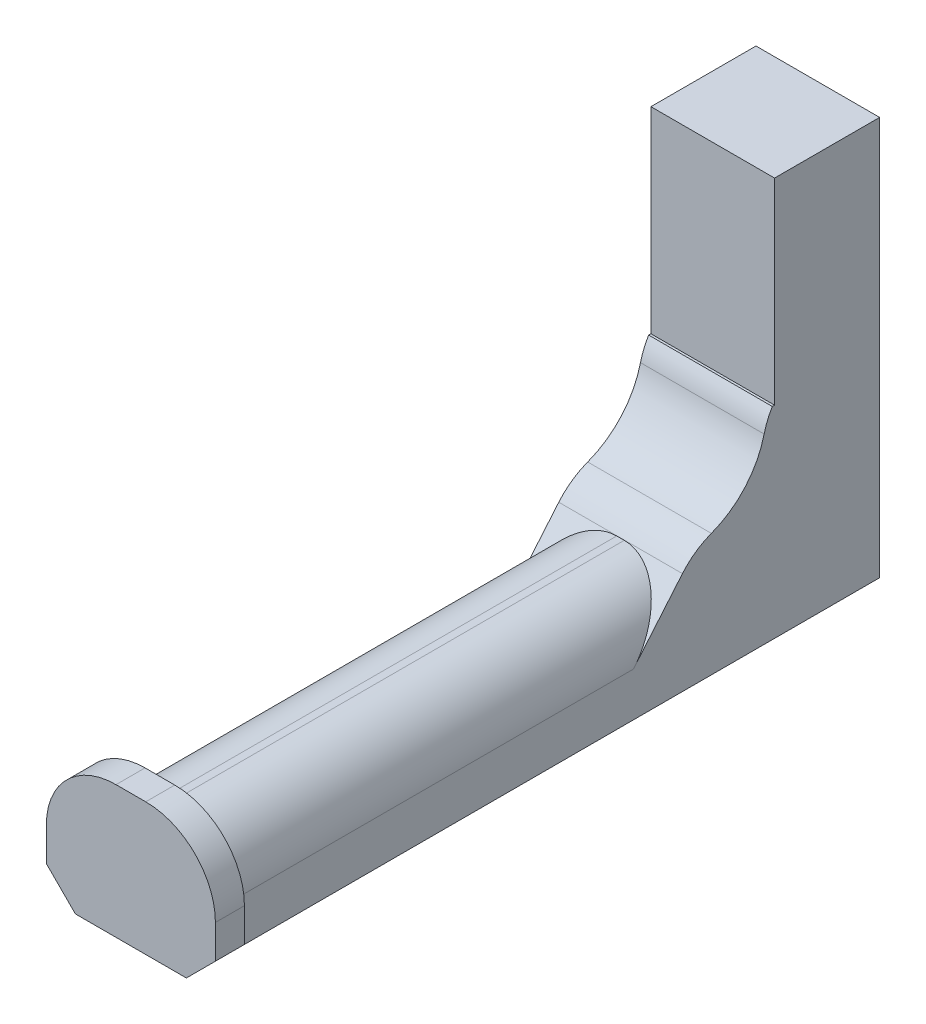
ISO-10303-21;
HEADER;
FILE_DESCRIPTION(('STEP AP214'),'2;1');
FILE_NAME('part.step','',(''),(''),'','','');
FILE_SCHEMA(('AUTOMOTIVE_DESIGN { 1 0 10303 214 1 1 1 1 }'));
ENDSEC;
DATA;
#1=APPLICATION_CONTEXT('core data for automotive mechanical design processes');
#2=APPLICATION_PROTOCOL_DEFINITION('international standard','automotive_design',2000,#1);
#3=PRODUCT_CONTEXT('',#1,'mechanical');
#4=PRODUCT('Part','Part','',(#3));
#5=PRODUCT_RELATED_PRODUCT_CATEGORY('part','',(#4));
#6=PRODUCT_DEFINITION_FORMATION('','',#4);
#7=PRODUCT_DEFINITION_CONTEXT('part definition',#1,'design');
#8=PRODUCT_DEFINITION('design','',#6,#7);
#9=PRODUCT_DEFINITION_SHAPE('','',#8);
#10=(LENGTH_UNIT() NAMED_UNIT(*) SI_UNIT(.MILLI.,.METRE.));
#11=(NAMED_UNIT(*) PLANE_ANGLE_UNIT() SI_UNIT($,.RADIAN.));
#12=(NAMED_UNIT(*) SI_UNIT($,.STERADIAN.) SOLID_ANGLE_UNIT());
#13=UNCERTAINTY_MEASURE_WITH_UNIT(LENGTH_MEASURE(1.E-05),#10,'distance_accuracy_value','');
#14=(GEOMETRIC_REPRESENTATION_CONTEXT(3) GLOBAL_UNCERTAINTY_ASSIGNED_CONTEXT((#13)) GLOBAL_UNIT_ASSIGNED_CONTEXT((#10,
#11,#12)) REPRESENTATION_CONTEXT('',''));
#15=CARTESIAN_POINT('',(0.,0.,0.));
#16=DIRECTION('',(0.,0.,1.));
#17=DIRECTION('',(1.,0.,0.));
#18=AXIS2_PLACEMENT_3D('',#15,#16,#17);
#19=CARTESIAN_POINT('',(0.,0.,0.));
#20=DIRECTION('',(0.,0.,-1.));
#21=DIRECTION('',(-1.,0.,0.));
#22=AXIS2_PLACEMENT_3D('',#19,#20,#21);
#23=PLANE('',#22);
#24=DIRECTION('',(-1.,0.,0.));
#25=VECTOR('',#24,1.);
#26=CARTESIAN_POINT('',(-10.65,1.12293527824647,0.));
#27=LINE('',#26,#25);
#28=CARTESIAN_POINT('',(10.65,1.12293527824647,0.));
#29=VERTEX_POINT('',#28);
#30=CARTESIAN_POINT('',(-10.65,1.12293527824647,0.));
#31=VERTEX_POINT('',#30);
#32=EDGE_CURVE('E417',#29,#31,#27,.T.);
#33=ORIENTED_EDGE('',*,*,#32,.F.);
#34=DIRECTION('',(0.,1.,0.));
#35=VECTOR('',#34,1.);
#36=CARTESIAN_POINT('',(10.65,-35.,0.));
#37=LINE('',#36,#35);
#38=CARTESIAN_POINT('',(10.65,35.,0.));
#39=VERTEX_POINT('',#38);
#40=EDGE_CURVE('E246',#29,#39,#37,.T.);
#41=ORIENTED_EDGE('',*,*,#40,.T.);
#42=DIRECTION('',(-1.,0.,0.));
#43=VECTOR('',#42,1.);
#44=CARTESIAN_POINT('',(-10.65,35.,0.));
#45=LINE('',#44,#43);
#46=CARTESIAN_POINT('',(-10.65,35.,0.));
#47=VERTEX_POINT('',#46);
#48=EDGE_CURVE('E255',#39,#47,#45,.T.);
#49=ORIENTED_EDGE('',*,*,#48,.T.);
#50=DIRECTION('',(0.,-1.,0.));
#51=VECTOR('',#50,1.);
#52=CARTESIAN_POINT('',(-10.65,-35.,0.));
#53=LINE('',#52,#51);
#54=EDGE_CURVE('E251',#47,#31,#53,.T.);
#55=ORIENTED_EDGE('',*,*,#54,.T.);
#56=EDGE_LOOP('',(#33,#41,#49,#55));
#57=FACE_BOUND('',#56,.T.);
#58=ADVANCED_FACE('F33',(#57),#23,.F.);
#59=CARTESIAN_POINT('',(-10.65,-16.0990655931812,95.));
#60=DIRECTION('',(0.,-1.,0.));
#61=DIRECTION('',(0.,0.,-1.));
#62=AXIS2_PLACEMENT_3D('',#59,#60,#61);
#63=PLANE('',#62);
#64=DIRECTION('',(1.,0.,0.));
#65=VECTOR('',#64,1.);
#66=CARTESIAN_POINT('',(-10.65,-16.0990655931812,15.891773496986));
#67=LINE('',#66,#65);
#68=CARTESIAN_POINT('',(0.649999999999998,-16.0990655931812,15.891773496986));
#69=VERTEX_POINT('',#68);
#70=CARTESIAN_POINT('',(-0.650000000000001,-16.0990655931812,15.891773496986));
#71=VERTEX_POINT('',#70);
#72=EDGE_CURVE('E281',#69,#71,#67,.F.);
#73=ORIENTED_EDGE('',*,*,#72,.T.);
#74=DIRECTION('',(0.,0.,-1.));
#75=VECTOR('',#74,1.);
#76=CARTESIAN_POINT('',(-0.650000000000001,-16.0990655931812,95.));
#77=LINE('',#76,#75);
#78=CARTESIAN_POINT('',(-0.650000000000001,-16.0990655931812,95.));
#79=VERTEX_POINT('',#78);
#80=EDGE_CURVE('E447',#71,#79,#77,.F.);
#81=ORIENTED_EDGE('',*,*,#80,.T.);
#82=DIRECTION('',(-1.,0.,0.));
#83=VECTOR('',#82,1.);
#84=CARTESIAN_POINT('',(-10.65,-16.0990655931812,95.));
#85=LINE('',#84,#83);
#86=CARTESIAN_POINT('',(0.649999999999998,-16.0990655931812,95.));
#87=VERTEX_POINT('',#86);
#88=EDGE_CURVE('E219',#87,#79,#85,.T.);
#89=ORIENTED_EDGE('',*,*,#88,.F.);
#90=DIRECTION('',(0.,0.,-1.));
#91=VECTOR('',#90,1.);
#92=CARTESIAN_POINT('',(0.649999999999998,-16.0990655931812,15.891773496986));
#93=LINE('',#92,#91);
#94=EDGE_CURVE('E450',#87,#69,#93,.T.);
#95=ORIENTED_EDGE('',*,*,#94,.T.);
#96=EDGE_LOOP('',(#73,#81,#89,#95));
#97=FACE_BOUND('',#96,.T.);
#98=ADVANCED_FACE('F466',(#97),#63,.F.);
#99=CARTESIAN_POINT('',(0.,0.,-3.));
#100=DIRECTION('',(0.,0.,-1.));
#101=DIRECTION('',(-1.,0.,0.));
#102=AXIS2_PLACEMENT_3D('',#99,#100,#101);
#103=PLANE('',#102);
#104=DIRECTION('',(0.,-1.,0.));
#105=VECTOR('',#104,1.);
#106=CARTESIAN_POINT('',(-7.69999999999999,35.,-3.));
#107=LINE('',#106,#105);
#108=CARTESIAN_POINT('',(-7.69999999999999,32.,-3.));
#109=VERTEX_POINT('',#108);
#110=CARTESIAN_POINT('',(-7.7,-35.,-3.));
#111=VERTEX_POINT('',#110);
#112=EDGE_CURVE('E208',#109,#111,#107,.T.);
#113=ORIENTED_EDGE('',*,*,#112,.F.);
#114=DIRECTION('',(-1.,0.,0.));
#115=VECTOR('',#114,1.);
#116=CARTESIAN_POINT('',(7.70000000000001,32.,-3.));
#117=LINE('',#116,#115);
#118=CARTESIAN_POINT('',(7.70000000000001,32.,-3.));
#119=VERTEX_POINT('',#118);
#120=EDGE_CURVE('E218',#119,#109,#117,.T.);
#121=ORIENTED_EDGE('',*,*,#120,.F.);
#122=DIRECTION('',(0.,1.,0.));
#123=VECTOR('',#122,1.);
#124=CARTESIAN_POINT('',(7.70000000000001,35.,-3.));
#125=LINE('',#124,#123);
#126=CARTESIAN_POINT('',(7.7,-35.,-3.));
#127=VERTEX_POINT('',#126);
#128=EDGE_CURVE('E217',#127,#119,#125,.T.);
#129=ORIENTED_EDGE('',*,*,#128,.F.);
#130=DIRECTION('',(1.,0.,0.));
#131=VECTOR('',#130,1.);
#132=CARTESIAN_POINT('',(-10.65,-35.,-3.));
#133=LINE('',#132,#131);
#134=EDGE_CURVE('E249',#111,#127,#133,.T.);
#135=ORIENTED_EDGE('',*,*,#134,.F.);
#136=EDGE_LOOP('',(#113,#121,#129,#135));
#137=FACE_BOUND('',#136,.T.);
#138=ADVANCED_FACE('F468',(#137),#103,.T.);
#139=CARTESIAN_POINT('',(7.70000000000001,35.,-18.1));
#140=DIRECTION('',(1.,0.,0.));
#141=DIRECTION('',(0.,1.,0.));
#142=AXIS2_PLACEMENT_3D('',#139,#140,#141);
#143=PLANE('',#142);
#144=DIRECTION('',(0.,0.,1.));
#145=VECTOR('',#144,1.);
#146=CARTESIAN_POINT('',(7.70000000000001,32.,-33.7894869259642));
#147=LINE('',#146,#145);
#148=CARTESIAN_POINT('',(7.70000000000001,32.,-18.1));
#149=VERTEX_POINT('',#148);
#150=EDGE_CURVE('E201',#149,#119,#147,.T.);
#151=ORIENTED_EDGE('',*,*,#150,.F.);
#152=DIRECTION('',(0.,1.,0.));
#153=VECTOR('',#152,1.);
#154=CARTESIAN_POINT('',(7.70000000000001,35.,-18.1));
#155=LINE('',#154,#153);
#156=CARTESIAN_POINT('',(7.7,-35.,-18.1));
#157=VERTEX_POINT('',#156);
#158=EDGE_CURVE('E215',#157,#149,#155,.T.);
#159=ORIENTED_EDGE('',*,*,#158,.F.);
#160=DIRECTION('',(0.,0.,1.));
#161=VECTOR('',#160,1.);
#162=CARTESIAN_POINT('',(7.7,-35.,-18.1));
#163=LINE('',#162,#161);
#164=EDGE_CURVE('E229',#157,#127,#163,.T.);
#165=ORIENTED_EDGE('',*,*,#164,.T.);
#166=ORIENTED_EDGE('',*,*,#128,.T.);
#167=EDGE_LOOP('',(#151,#159,#165,#166));
#168=FACE_BOUND('',#167,.T.);
#169=ADVANCED_FACE('F213',(#168),#143,.F.);
#170=CARTESIAN_POINT('',(-7.69999999999999,35.,-18.1));
#171=DIRECTION('',(-1.,0.,0.));
#172=DIRECTION('',(0.,-1.,0.));
#173=AXIS2_PLACEMENT_3D('',#170,#171,#172);
#174=PLANE('',#173);
#175=DIRECTION('',(0.,0.,1.));
#176=VECTOR('',#175,1.);
#177=CARTESIAN_POINT('',(-7.69999999999999,32.,-33.7894869259642));
#178=LINE('',#177,#176);
#179=CARTESIAN_POINT('',(-7.69999999999999,32.,-18.1));
#180=VERTEX_POINT('',#179);
#181=EDGE_CURVE('E204',#180,#109,#178,.T.);
#182=ORIENTED_EDGE('',*,*,#181,.T.);
#183=ORIENTED_EDGE('',*,*,#112,.T.);
#184=DIRECTION('',(0.,0.,1.));
#185=VECTOR('',#184,1.);
#186=CARTESIAN_POINT('',(-7.7,-35.,-18.1));
#187=LINE('',#186,#185);
#188=CARTESIAN_POINT('',(-7.7,-35.,-18.1));
#189=VERTEX_POINT('',#188);
#190=EDGE_CURVE('E242',#189,#111,#187,.T.);
#191=ORIENTED_EDGE('',*,*,#190,.F.);
#192=DIRECTION('',(0.,-1.,0.));
#193=VECTOR('',#192,1.);
#194=CARTESIAN_POINT('',(-7.69999999999999,35.,-18.1));
#195=LINE('',#194,#193);
#196=EDGE_CURVE('E369',#180,#189,#195,.T.);
#197=ORIENTED_EDGE('',*,*,#196,.F.);
#198=EDGE_LOOP('',(#182,#183,#191,#197));
#199=FACE_BOUND('',#198,.T.);
#200=ADVANCED_FACE('F485',(#199),#174,.F.);
#201=CARTESIAN_POINT('',(10.65,-35.,-3.));
#202=DIRECTION('',(1.,0.,0.));
#203=DIRECTION('',(0.,0.,-1.));
#204=AXIS2_PLACEMENT_3D('',#201,#202,#203);
#205=PLANE('',#204);
#206=DIRECTION('',(0.,0.764976195533657,-0.644058553445921));
#207=VECTOR('',#206,1.);
#208=CARTESIAN_POINT('',(10.65,-17.8518988354685,17.3675413039462));
#209=LINE('',#208,#207);
#210=CARTESIAN_POINT('',(10.65,-16.075158958114,15.8716457166851));
#211=VERTEX_POINT('',#210);
#212=CARTESIAN_POINT('',(10.65,-26.0990655931812,24.3111015389078));
#213=VERTEX_POINT('',#212);
#214=EDGE_CURVE('E48',#211,#213,#209,.F.);
#215=ORIENTED_EDGE('',*,*,#214,.T.);
#216=DIRECTION('',(0.,0.,-1.));
#217=VECTOR('',#216,1.);
#218=CARTESIAN_POINT('',(10.65,-26.0990655931812,95.));
#219=LINE('',#218,#217);
#220=CARTESIAN_POINT('',(10.65,-26.0990655931812,95.));
#221=VERTEX_POINT('',#220);
#222=EDGE_CURVE('E53',#213,#221,#219,.F.);
#223=ORIENTED_EDGE('',*,*,#222,.T.);
#224=DIRECTION('',(0.,1.,0.));
#225=VECTOR('',#224,1.);
#226=CARTESIAN_POINT('',(10.65,-16.0990655931812,95.));
#227=LINE('',#226,#225);
#228=CARTESIAN_POINT('',(10.65,-33.6771159928631,95.));
#229=VERTEX_POINT('',#228);
#230=EDGE_CURVE('E306',#229,#221,#227,.T.);
#231=ORIENTED_EDGE('',*,*,#230,.F.);
#232=DIRECTION('',(0.,0.,-1.));
#233=VECTOR('',#232,1.);
#234=CARTESIAN_POINT('',(10.65,-33.6771159928631,-3.));
#235=LINE('',#234,#233);
#236=CARTESIAN_POINT('',(10.65,-33.6771159928631,-18.1));
#237=VERTEX_POINT('',#236);
#238=EDGE_CURVE('E310',#229,#237,#235,.T.);
#239=ORIENTED_EDGE('',*,*,#238,.T.);
#240=DIRECTION('',(0.,-1.,0.));
#241=VECTOR('',#240,1.);
#242=CARTESIAN_POINT('',(10.65,35.,-18.1));
#243=LINE('',#242,#241);
#244=CARTESIAN_POINT('',(10.65,35.,-18.1));
#245=VERTEX_POINT('',#244);
#246=EDGE_CURVE('E231',#245,#237,#243,.T.);
#247=ORIENTED_EDGE('',*,*,#246,.F.);
#248=DIRECTION('',(0.,0.,1.));
#249=VECTOR('',#248,1.);
#250=CARTESIAN_POINT('',(10.65,35.,-3.));
#251=LINE('',#250,#249);
#252=EDGE_CURVE('E243',#245,#39,#251,.T.);
#253=ORIENTED_EDGE('',*,*,#252,.T.);
#254=ORIENTED_EDGE('',*,*,#40,.F.);
#255=DIRECTION('',(0.,0.,-1.));
#256=VECTOR('',#255,1.);
#257=CARTESIAN_POINT('',(10.65,1.12293527824647,16.));
#258=LINE('',#257,#256);
#259=CARTESIAN_POINT('',(10.65,1.12293527824647,0.392006009504509));
#260=VERTEX_POINT('',#259);
#261=EDGE_CURVE('E403',#260,#29,#258,.T.);
#262=ORIENTED_EDGE('',*,*,#261,.F.);
#263=CARTESIAN_POINT('',(10.65,-5.09532535075491,-9.87119206662224));
#264=DIRECTION('',(1.,0.,0.));
#265=DIRECTION('',(0.,0.,-1.));
#266=AXIS2_PLACEMENT_3D('',#263,#264,#265);
#267=CIRCLE('',#266,12.);
#268=CARTESIAN_POINT('',(10.65,-2.29093778306864,1.79651595038808));
#269=VERTEX_POINT('',#268);
#270=EDGE_CURVE('E351',#260,#269,#267,.T.);
#271=ORIENTED_EDGE('',*,*,#270,.T.);
#272=CARTESIAN_POINT('',(10.65,1.12293527824647,16.));
#273=DIRECTION('',(1.,0.,0.));
#274=DIRECTION('',(0.,0.,-1.));
#275=AXIS2_PLACEMENT_3D('',#272,#273,#274);
#276=CIRCLE('',#275,14.6079939904955);
#277=CARTESIAN_POINT('',(10.65,-12.5620685263238,10.8897985073726));
#278=VERTEX_POINT('',#277);
#279=EDGE_CURVE('E420',#278,#269,#276,.T.);
#280=ORIENTED_EDGE('',*,*,#279,.F.);
#281=CARTESIAN_POINT('',(10.65,-23.8038615994651,6.69193137028119));
#282=DIRECTION('',(1.,0.,0.));
#283=DIRECTION('',(0.,0.,-1.));
#284=AXIS2_PLACEMENT_3D('',#281,#282,#283);
#285=CIRCLE('',#284,12.);
#286=EDGE_CURVE('E339',#278,#211,#285,.T.);
#287=ORIENTED_EDGE('',*,*,#286,.T.);
#288=EDGE_LOOP('',(#215,#223,#231,#239,#247,#253,#254,#262,#271,#280,#287));
#289=FACE_BOUND('',#288,.T.);
#290=ADVANCED_FACE('F272',(#289),#205,.T.);
#291=CARTESIAN_POINT('',(-10.65,-35.,-3.));
#292=DIRECTION('',(0.,-1.,0.));
#293=DIRECTION('',(0.,0.,-1.));
#294=AXIS2_PLACEMENT_3D('',#291,#292,#293);
#295=PLANE('',#294);
#296=DIRECTION('',(-1.,0.,0.));
#297=VECTOR('',#296,1.);
#298=CARTESIAN_POINT('',(10.65,-35.,-18.1));
#299=LINE('',#298,#297);
#300=CARTESIAN_POINT('',(9.32711599286305,-35.,-18.1));
#301=VERTEX_POINT('',#300);
#302=EDGE_CURVE('E224',#301,#157,#299,.T.);
#303=ORIENTED_EDGE('',*,*,#302,.F.);
#304=DIRECTION('',(0.,0.,1.));
#305=VECTOR('',#304,1.);
#306=CARTESIAN_POINT('',(9.32711599286305,-35.,100.));
#307=LINE('',#306,#305);
#308=CARTESIAN_POINT('',(9.32711599286305,-35.,100.));
#309=VERTEX_POINT('',#308);
#310=EDGE_CURVE('E314',#301,#309,#307,.T.);
#311=ORIENTED_EDGE('',*,*,#310,.T.);
#312=DIRECTION('',(1.,0.,0.));
#313=VECTOR('',#312,1.);
#314=CARTESIAN_POINT('',(-14.7908997357149,-35.,100.));
#315=LINE('',#314,#313);
#316=CARTESIAN_POINT('',(-9.79089973571489,-35.,100.));
#317=VERTEX_POINT('',#316);
#318=EDGE_CURVE('E356',#317,#309,#315,.T.);
#319=ORIENTED_EDGE('',*,*,#318,.F.);
#320=DIRECTION('',(0.,0.,-1.));
#321=VECTOR('',#320,1.);
#322=CARTESIAN_POINT('',(-9.79089973571489,-35.,95.));
#323=LINE('',#322,#321);
#324=CARTESIAN_POINT('',(-9.79089973571489,-35.,-18.1));
#325=VERTEX_POINT('',#324);
#326=EDGE_CURVE('E286',#317,#325,#323,.T.);
#327=ORIENTED_EDGE('',*,*,#326,.T.);
#328=DIRECTION('',(-1.,0.,0.));
#329=VECTOR('',#328,1.);
#330=CARTESIAN_POINT('',(-10.65,-35.,-18.1));
#331=LINE('',#330,#329);
#332=EDGE_CURVE('E371',#189,#325,#331,.T.);
#333=ORIENTED_EDGE('',*,*,#332,.F.);
#334=ORIENTED_EDGE('',*,*,#190,.T.);
#335=ORIENTED_EDGE('',*,*,#134,.T.);
#336=ORIENTED_EDGE('',*,*,#164,.F.);
#337=EDGE_LOOP('',(#303,#311,#319,#327,#333,#334,#335,#336));
#338=FACE_BOUND('',#337,.T.);
#339=ADVANCED_FACE('F386',(#338),#295,.T.);
#340=CARTESIAN_POINT('',(-10.65,-35.,-3.));
#341=DIRECTION('',(-1.,0.,0.));
#342=DIRECTION('',(0.,0.,1.));
#343=AXIS2_PLACEMENT_3D('',#340,#341,#342);
#344=PLANE('',#343);
#345=DIRECTION('',(0.,-1.,0.));
#346=VECTOR('',#345,1.);
#347=CARTESIAN_POINT('',(-10.65,-16.0990655931812,95.));
#348=LINE('',#347,#346);
#349=CARTESIAN_POINT('',(-10.65,-26.0990655931812,95.));
#350=VERTEX_POINT('',#349);
#351=CARTESIAN_POINT('',(-10.65,-34.1408997357149,95.));
#352=VERTEX_POINT('',#351);
#353=EDGE_CURVE('E308',#350,#352,#348,.T.);
#354=ORIENTED_EDGE('',*,*,#353,.F.);
#355=DIRECTION('',(0.,0.,-1.));
#356=VECTOR('',#355,1.);
#357=CARTESIAN_POINT('',(-10.65,-26.0990655931812,15.891773496986));
#358=LINE('',#357,#356);
#359=CARTESIAN_POINT('',(-10.65,-26.0990655931812,24.3111015389078));
#360=VERTEX_POINT('',#359);
#361=EDGE_CURVE('E353',#350,#360,#358,.T.);
#362=ORIENTED_EDGE('',*,*,#361,.T.);
#363=DIRECTION('',(0.,-0.764976195533657,0.644058553445921));
#364=VECTOR('',#363,1.);
#365=CARTESIAN_POINT('',(-10.65,-17.8518988354685,17.3675413039462));
#366=LINE('',#365,#364);
#367=CARTESIAN_POINT('',(-10.65,-16.075158958114,15.8716457166851));
#368=VERTEX_POINT('',#367);
#369=EDGE_CURVE('E261',#360,#368,#366,.F.);
#370=ORIENTED_EDGE('',*,*,#369,.T.);
#371=CARTESIAN_POINT('',(-10.65,-23.8038615994651,6.69193137028119));
#372=DIRECTION('',(-1.,0.,0.));
#373=DIRECTION('',(0.,0.,1.));
#374=AXIS2_PLACEMENT_3D('',#371,#372,#373);
#375=CIRCLE('',#374,12.);
#376=CARTESIAN_POINT('',(-10.65,-12.5620685263238,10.8897985073726));
#377=VERTEX_POINT('',#376);
#378=EDGE_CURVE('E343',#368,#377,#375,.T.);
#379=ORIENTED_EDGE('',*,*,#378,.T.);
#380=CARTESIAN_POINT('',(-10.65,1.12293527824647,16.));
#381=DIRECTION('',(-1.,0.,0.));
#382=DIRECTION('',(0.,0.,1.));
#383=AXIS2_PLACEMENT_3D('',#380,#381,#382);
#384=CIRCLE('',#383,14.6079939904955);
#385=CARTESIAN_POINT('',(-10.65,-2.29093778306864,1.79651595038808));
#386=VERTEX_POINT('',#385);
#387=EDGE_CURVE('E423',#386,#377,#384,.T.);
#388=ORIENTED_EDGE('',*,*,#387,.F.);
#389=CARTESIAN_POINT('',(-10.65,-5.09532535075491,-9.87119206662224));
#390=DIRECTION('',(-1.,0.,0.));
#391=DIRECTION('',(0.,0.,1.));
#392=AXIS2_PLACEMENT_3D('',#389,#390,#391);
#393=CIRCLE('',#392,12.);
#394=CARTESIAN_POINT('',(-10.65,1.12293527824647,0.392006009504509));
#395=VERTEX_POINT('',#394);
#396=EDGE_CURVE('E349',#386,#395,#393,.T.);
#397=ORIENTED_EDGE('',*,*,#396,.T.);
#398=DIRECTION('',(0.,0.,-1.));
#399=VECTOR('',#398,1.);
#400=CARTESIAN_POINT('',(-10.65,1.12293527824647,16.));
#401=LINE('',#400,#399);
#402=EDGE_CURVE('E415',#395,#31,#401,.T.);
#403=ORIENTED_EDGE('',*,*,#402,.T.);
#404=ORIENTED_EDGE('',*,*,#54,.F.);
#405=DIRECTION('',(0.,0.,1.));
#406=VECTOR('',#405,1.);
#407=CARTESIAN_POINT('',(-10.65,35.,-3.));
#408=LINE('',#407,#406);
#409=CARTESIAN_POINT('',(-10.65,35.,-18.1));
#410=VERTEX_POINT('',#409);
#411=EDGE_CURVE('E260',#410,#47,#408,.T.);
#412=ORIENTED_EDGE('',*,*,#411,.F.);
#413=DIRECTION('',(0.,1.,0.));
#414=VECTOR('',#413,1.);
#415=CARTESIAN_POINT('',(-10.65,35.,-18.1));
#416=LINE('',#415,#414);
#417=CARTESIAN_POINT('',(-10.65,-34.1408997357149,-18.1));
#418=VERTEX_POINT('',#417);
#419=EDGE_CURVE('E367',#418,#410,#416,.T.);
#420=ORIENTED_EDGE('',*,*,#419,.F.);
#421=DIRECTION('',(0.,0.,1.));
#422=VECTOR('',#421,1.);
#423=CARTESIAN_POINT('',(-10.65,-34.1408997357149,-3.));
#424=LINE('',#423,#422);
#425=EDGE_CURVE('E291',#418,#352,#424,.T.);
#426=ORIENTED_EDGE('',*,*,#425,.T.);
#427=EDGE_LOOP('',(#354,#362,#370,#379,#388,#397,#403,#404,#412,#420,#426));
#428=FACE_BOUND('',#427,.T.);
#429=ADVANCED_FACE('F433',(#428),#344,.T.);
#430=CARTESIAN_POINT('',(-10.65,35.,-3.));
#431=DIRECTION('',(0.,1.,0.));
#432=DIRECTION('',(0.,0.,1.));
#433=AXIS2_PLACEMENT_3D('',#430,#431,#432);
#434=PLANE('',#433);
#435=ORIENTED_EDGE('',*,*,#48,.F.);
#436=ORIENTED_EDGE('',*,*,#252,.F.);
#437=DIRECTION('',(1.,0.,0.));
#438=VECTOR('',#437,1.);
#439=CARTESIAN_POINT('',(10.65,35.,-18.1));
#440=LINE('',#439,#438);
#441=EDGE_CURVE('E226',#410,#245,#440,.T.);
#442=ORIENTED_EDGE('',*,*,#441,.F.);
#443=ORIENTED_EDGE('',*,*,#411,.T.);
#444=EDGE_LOOP('',(#435,#436,#442,#443));
#445=FACE_BOUND('',#444,.T.);
#446=ADVANCED_FACE('F275',(#445),#434,.T.);
#447=CARTESIAN_POINT('',(0.,0.,-18.1));
#448=DIRECTION('',(0.,0.,-1.));
#449=DIRECTION('',(-1.,0.,0.));
#450=AXIS2_PLACEMENT_3D('',#447,#448,#449);
#451=PLANE('',#450);
#452=ORIENTED_EDGE('',*,*,#246,.T.);
#453=DIRECTION('',(-0.70710678118655,-0.707106781186545,0.));
#454=VECTOR('',#453,1.);
#455=CARTESIAN_POINT('',(22.1635579964315,-22.1635579964316,-18.1));
#456=LINE('',#455,#454);
#457=EDGE_CURVE('E312',#237,#301,#456,.T.);
#458=ORIENTED_EDGE('',*,*,#457,.T.);
#459=ORIENTED_EDGE('',*,*,#302,.T.);
#460=ORIENTED_EDGE('',*,*,#158,.T.);
#461=DIRECTION('',(-1.,0.,0.));
#462=VECTOR('',#461,1.);
#463=CARTESIAN_POINT('',(7.70000000000001,32.,-18.1));
#464=LINE('',#463,#462);
#465=EDGE_CURVE('E198',#149,#180,#464,.T.);
#466=ORIENTED_EDGE('',*,*,#465,.T.);
#467=ORIENTED_EDGE('',*,*,#196,.T.);
#468=ORIENTED_EDGE('',*,*,#332,.T.);
#469=DIRECTION('',(-0.707106781186546,0.707106781186549,0.));
#470=VECTOR('',#469,1.);
#471=CARTESIAN_POINT('',(-22.3954498678575,-22.3954498678574,-18.1));
#472=LINE('',#471,#470);
#473=EDGE_CURVE('E289',#325,#418,#472,.T.);
#474=ORIENTED_EDGE('',*,*,#473,.T.);
#475=ORIENTED_EDGE('',*,*,#419,.T.);
#476=ORIENTED_EDGE('',*,*,#441,.T.);
#477=EDGE_LOOP('',(#452,#458,#459,#460,#466,#467,#468,#474,#475,#476));
#478=FACE_BOUND('',#477,.T.);
#479=ADVANCED_FACE('F222',(#478),#451,.T.);
#480=CARTESIAN_POINT('',(7.70000000000001,32.,-33.7894869259642));
#481=DIRECTION('',(0.,1.,0.));
#482=DIRECTION('',(0.,0.,1.));
#483=AXIS2_PLACEMENT_3D('',#480,#481,#482);
#484=PLANE('',#483);
#485=ORIENTED_EDGE('',*,*,#465,.F.);
#486=ORIENTED_EDGE('',*,*,#150,.T.);
#487=ORIENTED_EDGE('',*,*,#120,.T.);
#488=ORIENTED_EDGE('',*,*,#181,.F.);
#489=EDGE_LOOP('',(#485,#486,#487,#488));
#490=FACE_BOUND('',#489,.T.);
#491=ADVANCED_FACE('F200',(#490),#484,.F.);
#492=CARTESIAN_POINT('',(0.,0.,95.));
#493=DIRECTION('',(0.,0.,1.));
#494=DIRECTION('',(1.,0.,0.));
#495=AXIS2_PLACEMENT_3D('',#492,#493,#494);
#496=PLANE('',#495);
#497=DIRECTION('',(0.,-1.,0.));
#498=VECTOR('',#497,1.);
#499=CARTESIAN_POINT('',(-14.7908997357149,-12.2147398767147,95.));
#500=LINE('',#499,#498);
#501=CARTESIAN_POINT('',(-14.7908997357149,-24.2147398767147,95.));
#502=VERTEX_POINT('',#501);
#503=CARTESIAN_POINT('',(-14.7908997357149,-30.,95.));
#504=VERTEX_POINT('',#503);
#505=EDGE_CURVE('E361',#502,#504,#500,.T.);
#506=ORIENTED_EDGE('',*,*,#505,.F.);
#507=CARTESIAN_POINT('',(-2.7908997357149,-24.2147398767147,95.));
#508=DIRECTION('',(0.,0.,1.));
#509=DIRECTION('',(1.,0.,0.));
#510=AXIS2_PLACEMENT_3D('',#507,#508,#509);
#511=CIRCLE('',#510,12.);
#512=CARTESIAN_POINT('',(-2.7908997357149,-12.2147398767147,95.));
#513=VERTEX_POINT('',#512);
#514=EDGE_CURVE('E323',#502,#513,#511,.F.);
#515=ORIENTED_EDGE('',*,*,#514,.T.);
#516=DIRECTION('',(-1.,0.,0.));
#517=VECTOR('',#516,1.);
#518=CARTESIAN_POINT('',(-14.7908997357149,-12.2147398767147,95.));
#519=LINE('',#518,#517);
#520=CARTESIAN_POINT('',(2.32711599286307,-12.2147398767147,95.));
#521=VERTEX_POINT('',#520);
#522=EDGE_CURVE('E402',#521,#513,#519,.T.);
#523=ORIENTED_EDGE('',*,*,#522,.F.);
#524=CARTESIAN_POINT('',(2.32711599286307,-24.2147398767147,95.));
#525=DIRECTION('',(0.,0.,1.));
#526=DIRECTION('',(1.,0.,0.));
#527=AXIS2_PLACEMENT_3D('',#524,#525,#526);
#528=CIRCLE('',#527,12.);
#529=CARTESIAN_POINT('',(14.3271159928631,-24.2147398767147,95.));
#530=VERTEX_POINT('',#529);
#531=EDGE_CURVE('E321',#521,#530,#528,.F.);
#532=ORIENTED_EDGE('',*,*,#531,.T.);
#533=DIRECTION('',(0.,1.,0.));
#534=VECTOR('',#533,1.);
#535=CARTESIAN_POINT('',(14.3271159928631,-12.2147398767147,95.));
#536=LINE('',#535,#534);
#537=CARTESIAN_POINT('',(14.3271159928631,-30.,95.));
#538=VERTEX_POINT('',#537);
#539=EDGE_CURVE('E400',#538,#530,#536,.T.);
#540=ORIENTED_EDGE('',*,*,#539,.F.);
#541=DIRECTION('',(-0.70710678118655,-0.707106781186545,0.));
#542=VECTOR('',#541,1.);
#543=CARTESIAN_POINT('',(14.3271159928631,-30.,95.));
#544=LINE('',#543,#542);
#545=EDGE_CURVE('E305',#538,#229,#544,.T.);
#546=ORIENTED_EDGE('',*,*,#545,.T.);
#547=ORIENTED_EDGE('',*,*,#230,.T.);
#548=CARTESIAN_POINT('',(0.649999999999998,-26.0990655931812,95.));
#549=DIRECTION('',(0.,0.,1.));
#550=DIRECTION('',(1.,0.,0.));
#551=AXIS2_PLACEMENT_3D('',#548,#549,#550);
#552=CIRCLE('',#551,10.);
#553=EDGE_CURVE('E11',#221,#87,#552,.T.);
#554=ORIENTED_EDGE('',*,*,#553,.T.);
#555=ORIENTED_EDGE('',*,*,#88,.T.);
#556=CARTESIAN_POINT('',(-0.650000000000001,-26.0990655931812,95.));
#557=DIRECTION('',(0.,0.,1.));
#558=DIRECTION('',(1.,0.,0.));
#559=AXIS2_PLACEMENT_3D('',#556,#557,#558);
#560=CIRCLE('',#559,10.);
#561=EDGE_CURVE('E444',#79,#350,#560,.T.);
#562=ORIENTED_EDGE('',*,*,#561,.T.);
#563=ORIENTED_EDGE('',*,*,#353,.T.);
#564=DIRECTION('',(-0.707106781186546,0.707106781186549,0.));
#565=VECTOR('',#564,1.);
#566=CARTESIAN_POINT('',(-9.79089973571489,-35.,95.));
#567=LINE('',#566,#565);
#568=EDGE_CURVE('E294',#352,#504,#567,.T.);
#569=ORIENTED_EDGE('',*,*,#568,.T.);
#570=EDGE_LOOP('',(#506,#515,#523,#532,#540,#546,#547,#554,#555,#562,#563,#569));
#571=FACE_BOUND('',#570,.T.);
#572=ADVANCED_FACE('F455',(#571),#496,.F.);
#573=CARTESIAN_POINT('',(14.3271159928631,-12.2147398767147,100.));
#574=DIRECTION('',(-1.,0.,0.));
#575=DIRECTION('',(0.,-1.,0.));
#576=AXIS2_PLACEMENT_3D('',#573,#574,#575);
#577=PLANE('',#576);
#578=ORIENTED_EDGE('',*,*,#539,.T.);
#579=DIRECTION('',(0.,0.,-1.));
#580=VECTOR('',#579,1.);
#581=CARTESIAN_POINT('',(14.3271159928631,-24.2147398767147,100.));
#582=LINE('',#581,#580);
#583=CARTESIAN_POINT('',(14.3271159928631,-24.2147398767147,100.));
#584=VERTEX_POINT('',#583);
#585=EDGE_CURVE('E334',#530,#584,#582,.F.);
#586=ORIENTED_EDGE('',*,*,#585,.T.);
#587=DIRECTION('',(0.,1.,0.));
#588=VECTOR('',#587,1.);
#589=CARTESIAN_POINT('',(14.3271159928631,-12.2147398767147,100.));
#590=LINE('',#589,#588);
#591=CARTESIAN_POINT('',(14.3271159928631,-30.,100.));
#592=VERTEX_POINT('',#591);
#593=EDGE_CURVE('E408',#592,#584,#590,.T.);
#594=ORIENTED_EDGE('',*,*,#593,.F.);
#595=DIRECTION('',(0.,0.,-1.));
#596=VECTOR('',#595,1.);
#597=CARTESIAN_POINT('',(14.3271159928631,-30.,95.));
#598=LINE('',#597,#596);
#599=EDGE_CURVE('E302',#592,#538,#598,.T.);
#600=ORIENTED_EDGE('',*,*,#599,.T.);
#601=EDGE_LOOP('',(#578,#586,#594,#600));
#602=FACE_BOUND('',#601,.T.);
#603=ADVANCED_FACE('F481',(#602),#577,.F.);
#604=CARTESIAN_POINT('',(-14.7908997357149,-12.2147398767147,100.));
#605=DIRECTION('',(0.,-1.,0.));
#606=DIRECTION('',(0.,0.,-1.));
#607=AXIS2_PLACEMENT_3D('',#604,#605,#606);
#608=PLANE('',#607);
#609=ORIENTED_EDGE('',*,*,#522,.T.);
#610=DIRECTION('',(0.,0.,-1.));
#611=VECTOR('',#610,1.);
#612=CARTESIAN_POINT('',(-2.7908997357149,-12.2147398767147,100.));
#613=LINE('',#612,#611);
#614=CARTESIAN_POINT('',(-2.7908997357149,-12.2147398767147,100.));
#615=VERTEX_POINT('',#614);
#616=EDGE_CURVE('E328',#513,#615,#613,.F.);
#617=ORIENTED_EDGE('',*,*,#616,.T.);
#618=DIRECTION('',(-1.,0.,0.));
#619=VECTOR('',#618,1.);
#620=CARTESIAN_POINT('',(-14.7908997357149,-12.2147398767147,100.));
#621=LINE('',#620,#619);
#622=CARTESIAN_POINT('',(2.32711599286307,-12.2147398767147,100.));
#623=VERTEX_POINT('',#622);
#624=EDGE_CURVE('E396',#623,#615,#621,.T.);
#625=ORIENTED_EDGE('',*,*,#624,.F.);
#626=DIRECTION('',(0.,0.,-1.));
#627=VECTOR('',#626,1.);
#628=CARTESIAN_POINT('',(2.32711599286307,-12.2147398767147,100.));
#629=LINE('',#628,#627);
#630=EDGE_CURVE('E325',#623,#521,#629,.T.);
#631=ORIENTED_EDGE('',*,*,#630,.T.);
#632=EDGE_LOOP('',(#609,#617,#625,#631));
#633=FACE_BOUND('',#632,.T.);
#634=ADVANCED_FACE('F594',(#633),#608,.F.);
#635=CARTESIAN_POINT('',(-14.7908997357149,-12.2147398767147,100.));
#636=DIRECTION('',(1.,0.,0.));
#637=DIRECTION('',(0.,1.,0.));
#638=AXIS2_PLACEMENT_3D('',#635,#636,#637);
#639=PLANE('',#638);
#640=DIRECTION('',(0.,-1.,0.));
#641=VECTOR('',#640,1.);
#642=CARTESIAN_POINT('',(-14.7908997357149,-12.2147398767147,100.));
#643=LINE('',#642,#641);
#644=CARTESIAN_POINT('',(-14.7908997357149,-24.2147398767147,100.));
#645=VERTEX_POINT('',#644);
#646=CARTESIAN_POINT('',(-14.7908997357149,-30.,100.));
#647=VERTEX_POINT('',#646);
#648=EDGE_CURVE('E394',#645,#647,#643,.T.);
#649=ORIENTED_EDGE('',*,*,#648,.F.);
#650=DIRECTION('',(0.,0.,-1.));
#651=VECTOR('',#650,1.);
#652=CARTESIAN_POINT('',(-14.7908997357149,-24.2147398767147,100.));
#653=LINE('',#652,#651);
#654=EDGE_CURVE('E318',#645,#502,#653,.T.);
#655=ORIENTED_EDGE('',*,*,#654,.T.);
#656=ORIENTED_EDGE('',*,*,#505,.T.);
#657=DIRECTION('',(0.,0.,1.));
#658=VECTOR('',#657,1.);
#659=CARTESIAN_POINT('',(-14.7908997357149,-30.,100.));
#660=LINE('',#659,#658);
#661=EDGE_CURVE('E297',#504,#647,#660,.T.);
#662=ORIENTED_EDGE('',*,*,#661,.T.);
#663=EDGE_LOOP('',(#649,#655,#656,#662));
#664=FACE_BOUND('',#663,.T.);
#665=ADVANCED_FACE('F603',(#664),#639,.F.);
#666=CARTESIAN_POINT('',(0.,0.,100.));
#667=DIRECTION('',(0.,0.,1.));
#668=DIRECTION('',(1.,0.,0.));
#669=AXIS2_PLACEMENT_3D('',#666,#667,#668);
#670=PLANE('',#669);
#671=ORIENTED_EDGE('',*,*,#624,.T.);
#672=CARTESIAN_POINT('',(-2.7908997357149,-24.2147398767147,100.));
#673=DIRECTION('',(0.,0.,1.));
#674=DIRECTION('',(1.,0.,0.));
#675=AXIS2_PLACEMENT_3D('',#672,#673,#674);
#676=CIRCLE('',#675,12.);
#677=EDGE_CURVE('E332',#615,#645,#676,.T.);
#678=ORIENTED_EDGE('',*,*,#677,.T.);
#679=ORIENTED_EDGE('',*,*,#648,.T.);
#680=DIRECTION('',(0.707106781186546,-0.707106781186549,0.));
#681=VECTOR('',#680,1.);
#682=CARTESIAN_POINT('',(-22.3954498678575,-22.3954498678574,100.));
#683=LINE('',#682,#681);
#684=EDGE_CURVE('E300',#647,#317,#683,.T.);
#685=ORIENTED_EDGE('',*,*,#684,.T.);
#686=ORIENTED_EDGE('',*,*,#318,.T.);
#687=DIRECTION('',(0.70710678118655,0.707106781186545,0.));
#688=VECTOR('',#687,1.);
#689=CARTESIAN_POINT('',(22.1635579964315,-22.1635579964316,100.));
#690=LINE('',#689,#688);
#691=EDGE_CURVE('E316',#309,#592,#690,.T.);
#692=ORIENTED_EDGE('',*,*,#691,.T.);
#693=ORIENTED_EDGE('',*,*,#593,.T.);
#694=CARTESIAN_POINT('',(2.32711599286307,-24.2147398767147,100.));
#695=DIRECTION('',(0.,0.,1.));
#696=DIRECTION('',(1.,0.,0.));
#697=AXIS2_PLACEMENT_3D('',#694,#695,#696);
#698=CIRCLE('',#697,12.);
#699=EDGE_CURVE('E330',#584,#623,#698,.T.);
#700=ORIENTED_EDGE('',*,*,#699,.T.);
#701=EDGE_LOOP('',(#671,#678,#679,#685,#686,#692,#693,#700));
#702=FACE_BOUND('',#701,.T.);
#703=ADVANCED_FACE('F390',(#702),#670,.T.);
#704=CARTESIAN_POINT('',(-10.65,1.12293527824647,16.));
#705=DIRECTION('',(0.,-1.,0.));
#706=DIRECTION('',(0.,0.,-1.));
#707=AXIS2_PLACEMENT_3D('',#704,#705,#706);
#708=PLANE('',#707);
#709=ORIENTED_EDGE('',*,*,#402,.F.);
#710=DIRECTION('',(1.,0.,0.));
#711=VECTOR('',#710,1.);
#712=CARTESIAN_POINT('',(-10.65,1.12293527824647,0.392006009504505));
#713=LINE('',#712,#711);
#714=EDGE_CURVE('E284',#395,#260,#713,.T.);
#715=ORIENTED_EDGE('',*,*,#714,.T.);
#716=ORIENTED_EDGE('',*,*,#261,.T.);
#717=ORIENTED_EDGE('',*,*,#32,.T.);
#718=EDGE_LOOP('',(#709,#715,#716,#717));
#719=FACE_BOUND('',#718,.T.);
#720=ADVANCED_FACE('F619',(#719),#708,.F.);
#721=CARTESIAN_POINT('',(14.3271409928631,1.12293527824647,16.));
#722=DIRECTION('',(-1.,0.,0.));
#723=DIRECTION('',(0.,0.,1.));
#724=AXIS2_PLACEMENT_3D('',#721,#722,#723);
#725=CYLINDRICAL_SURFACE('',#724,14.6079939904955);
#726=ORIENTED_EDGE('',*,*,#279,.T.);
#727=DIRECTION('',(-1.,0.,0.));
#728=VECTOR('',#727,1.);
#729=CARTESIAN_POINT('',(14.3271409928631,-2.29093778306864,1.79651595038808));
#730=LINE('',#729,#728);
#731=EDGE_CURVE('E346',#269,#386,#730,.T.);
#732=ORIENTED_EDGE('',*,*,#731,.T.);
#733=ORIENTED_EDGE('',*,*,#387,.T.);
#734=DIRECTION('',(-1.,0.,0.));
#735=VECTOR('',#734,1.);
#736=CARTESIAN_POINT('',(14.3271409928631,-12.5620685263238,10.8897985073726));
#737=LINE('',#736,#735);
#738=EDGE_CURVE('E336',#377,#278,#737,.F.);
#739=ORIENTED_EDGE('',*,*,#738,.T.);
#740=EDGE_LOOP('',(#726,#732,#733,#739));
#741=FACE_BOUND('',#740,.T.);
#742=ADVANCED_FACE('F426',(#741),#725,.F.);
#743=CARTESIAN_POINT('',(14.3271409928631,-16.2276108909474,16.));
#744=DIRECTION('',(0.,-0.644058553445921,-0.764976195533657));
#745=DIRECTION('',(-1.,0.,0.));
#746=AXIS2_PLACEMENT_3D('',#743,#744,#745);
#747=PLANE('',#746);
#748=ORIENTED_EDGE('',*,*,#214,.F.);
#749=DIRECTION('',(-1.,0.,0.));
#750=VECTOR('',#749,1.);
#751=CARTESIAN_POINT('',(-10.65,-16.075158958114,15.8716457166851));
#752=LINE('',#751,#750);
#753=EDGE_CURVE('E341',#211,#368,#752,.T.);
#754=ORIENTED_EDGE('',*,*,#753,.T.);
#755=ORIENTED_EDGE('',*,*,#369,.F.);
#756=CARTESIAN_POINT('',(-0.650000000000001,-26.0990655931812,24.3111015389078));
#757=DIRECTION('',(0.,-0.644058553445921,-0.764976195533657));
#758=DIRECTION('',(0.,-0.764976195533657,0.644058553445921));
#759=AXIS2_PLACEMENT_3D('',#756,#757,#758);
#760=ELLIPSE('',#759,13.0723021950034,10.);
#761=EDGE_CURVE('E446',#360,#71,#760,.T.);
#762=ORIENTED_EDGE('',*,*,#761,.T.);
#763=ORIENTED_EDGE('',*,*,#72,.F.);
#764=CARTESIAN_POINT('',(0.649999999999998,-26.0990655931812,24.3111015389078));
#765=DIRECTION('',(0.,-0.644058553445921,-0.764976195533657));
#766=DIRECTION('',(0.,-0.764976195533657,0.644058553445921));
#767=AXIS2_PLACEMENT_3D('',#764,#765,#766);
#768=ELLIPSE('',#767,13.0723021950034,10.);
#769=EDGE_CURVE('E41',#69,#213,#768,.T.);
#770=ORIENTED_EDGE('',*,*,#769,.T.);
#771=EDGE_LOOP('',(#748,#754,#755,#762,#763,#770));
#772=FACE_BOUND('',#771,.T.);
#773=ADVANCED_FACE('F439',(#772),#747,.F.);
#774=CARTESIAN_POINT('',(-9.79089973571489,-35.,-3.));
#775=DIRECTION('',(-0.707106781186549,-0.707106781186545,0.));
#776=DIRECTION('',(0.,0.,1.));
#777=AXIS2_PLACEMENT_3D('',#774,#775,#776);
#778=PLANE('',#777);
#779=ORIENTED_EDGE('',*,*,#684,.F.);
#780=ORIENTED_EDGE('',*,*,#661,.F.);
#781=ORIENTED_EDGE('',*,*,#568,.F.);
#782=ORIENTED_EDGE('',*,*,#425,.F.);
#783=ORIENTED_EDGE('',*,*,#473,.F.);
#784=ORIENTED_EDGE('',*,*,#326,.F.);
#785=EDGE_LOOP('',(#779,#780,#781,#782,#783,#784));
#786=FACE_BOUND('',#785,.T.);
#787=ADVANCED_FACE('F502',(#786),#778,.T.);
#788=CARTESIAN_POINT('',(14.3271159928631,-30.,100.));
#789=DIRECTION('',(0.707106781186545,-0.70710678118655,0.));
#790=DIRECTION('',(0.,0.,1.));
#791=AXIS2_PLACEMENT_3D('',#788,#789,#790);
#792=PLANE('',#791);
#793=ORIENTED_EDGE('',*,*,#691,.F.);
#794=ORIENTED_EDGE('',*,*,#310,.F.);
#795=ORIENTED_EDGE('',*,*,#457,.F.);
#796=ORIENTED_EDGE('',*,*,#238,.F.);
#797=ORIENTED_EDGE('',*,*,#545,.F.);
#798=ORIENTED_EDGE('',*,*,#599,.F.);
#799=EDGE_LOOP('',(#793,#794,#795,#796,#797,#798));
#800=FACE_BOUND('',#799,.T.);
#801=ADVANCED_FACE('F381',(#800),#792,.T.);
#802=CARTESIAN_POINT('',(-2.7908997357149,-24.2147398767147,100.));
#803=DIRECTION('',(0.,0.,-1.));
#804=DIRECTION('',(-1.,0.,0.));
#805=AXIS2_PLACEMENT_3D('',#802,#803,#804);
#806=CYLINDRICAL_SURFACE('',#805,12.);
#807=ORIENTED_EDGE('',*,*,#677,.F.);
#808=ORIENTED_EDGE('',*,*,#616,.F.);
#809=ORIENTED_EDGE('',*,*,#514,.F.);
#810=ORIENTED_EDGE('',*,*,#654,.F.);
#811=EDGE_LOOP('',(#807,#808,#809,#810));
#812=FACE_BOUND('',#811,.T.);
#813=ADVANCED_FACE('F508',(#812),#806,.T.);
#814=CARTESIAN_POINT('',(2.32711599286307,-24.2147398767147,100.));
#815=DIRECTION('',(0.,0.,-1.));
#816=DIRECTION('',(-1.,0.,0.));
#817=AXIS2_PLACEMENT_3D('',#814,#815,#816);
#818=CYLINDRICAL_SURFACE('',#817,12.);
#819=ORIENTED_EDGE('',*,*,#699,.F.);
#820=ORIENTED_EDGE('',*,*,#585,.F.);
#821=ORIENTED_EDGE('',*,*,#531,.F.);
#822=ORIENTED_EDGE('',*,*,#630,.F.);
#823=EDGE_LOOP('',(#819,#820,#821,#822));
#824=FACE_BOUND('',#823,.T.);
#825=ADVANCED_FACE('F511',(#824),#818,.T.);
#826=CARTESIAN_POINT('',(14.3271409928631,-23.8038615994651,6.69193137028119));
#827=DIRECTION('',(-1.,0.,0.));
#828=DIRECTION('',(0.,0.,1.));
#829=AXIS2_PLACEMENT_3D('',#826,#827,#828);
#830=CYLINDRICAL_SURFACE('',#829,12.);
#831=ORIENTED_EDGE('',*,*,#378,.F.);
#832=ORIENTED_EDGE('',*,*,#753,.F.);
#833=ORIENTED_EDGE('',*,*,#286,.F.);
#834=ORIENTED_EDGE('',*,*,#738,.F.);
#835=EDGE_LOOP('',(#831,#832,#833,#834));
#836=FACE_BOUND('',#835,.T.);
#837=ADVANCED_FACE('F437',(#836),#830,.T.);
#838=CARTESIAN_POINT('',(14.3271409928631,-5.09532535075491,-9.87119206662224));
#839=DIRECTION('',(-1.,0.,0.));
#840=DIRECTION('',(0.,0.,1.));
#841=AXIS2_PLACEMENT_3D('',#838,#839,#840);
#842=CYLINDRICAL_SURFACE('',#841,12.);
#843=ORIENTED_EDGE('',*,*,#270,.F.);
#844=ORIENTED_EDGE('',*,*,#714,.F.);
#845=ORIENTED_EDGE('',*,*,#396,.F.);
#846=ORIENTED_EDGE('',*,*,#731,.F.);
#847=EDGE_LOOP('',(#843,#844,#845,#846));
#848=FACE_BOUND('',#847,.T.);
#849=ADVANCED_FACE('F518',(#848),#842,.T.);
#850=CARTESIAN_POINT('',(-0.650000000000001,-26.0990655931812,-3.));
#851=DIRECTION('',(0.,0.,1.));
#852=DIRECTION('',(1.,0.,0.));
#853=AXIS2_PLACEMENT_3D('',#850,#851,#852);
#854=CYLINDRICAL_SURFACE('',#853,10.);
#855=ORIENTED_EDGE('',*,*,#561,.F.);
#856=ORIENTED_EDGE('',*,*,#80,.F.);
#857=ORIENTED_EDGE('',*,*,#761,.F.);
#858=ORIENTED_EDGE('',*,*,#361,.F.);
#859=EDGE_LOOP('',(#855,#856,#857,#858));
#860=FACE_BOUND('',#859,.T.);
#861=ADVANCED_FACE('F464',(#860),#854,.T.);
#862=CARTESIAN_POINT('',(0.649999999999998,-26.0990655931812,95.));
#863=DIRECTION('',(0.,0.,1.));
#864=DIRECTION('',(1.,0.,0.));
#865=AXIS2_PLACEMENT_3D('',#862,#863,#864);
#866=CYLINDRICAL_SURFACE('',#865,10.);
#867=ORIENTED_EDGE('',*,*,#553,.F.);
#868=ORIENTED_EDGE('',*,*,#222,.F.);
#869=ORIENTED_EDGE('',*,*,#769,.F.);
#870=ORIENTED_EDGE('',*,*,#94,.F.);
#871=EDGE_LOOP('',(#867,#868,#869,#870));
#872=FACE_BOUND('',#871,.T.);
#873=ADVANCED_FACE('F35',(#872),#866,.T.);
#874=CLOSED_SHELL('',(#58,#98,#138,#169,#200,#290,#339,#429,#446,#479,#491,#572,#603,#634,#665,
#703,#720,#742,#773,#787,#801,#813,#825,#837,#849,#861,#873));
#875=MANIFOLD_SOLID_BREP('B2',#874);
#876=ADVANCED_BREP_SHAPE_REPRESENTATION('',(#18,#875),#14);
#877=SHAPE_DEFINITION_REPRESENTATION(#9,#876);
ENDSEC;
END-ISO-10303-21;
